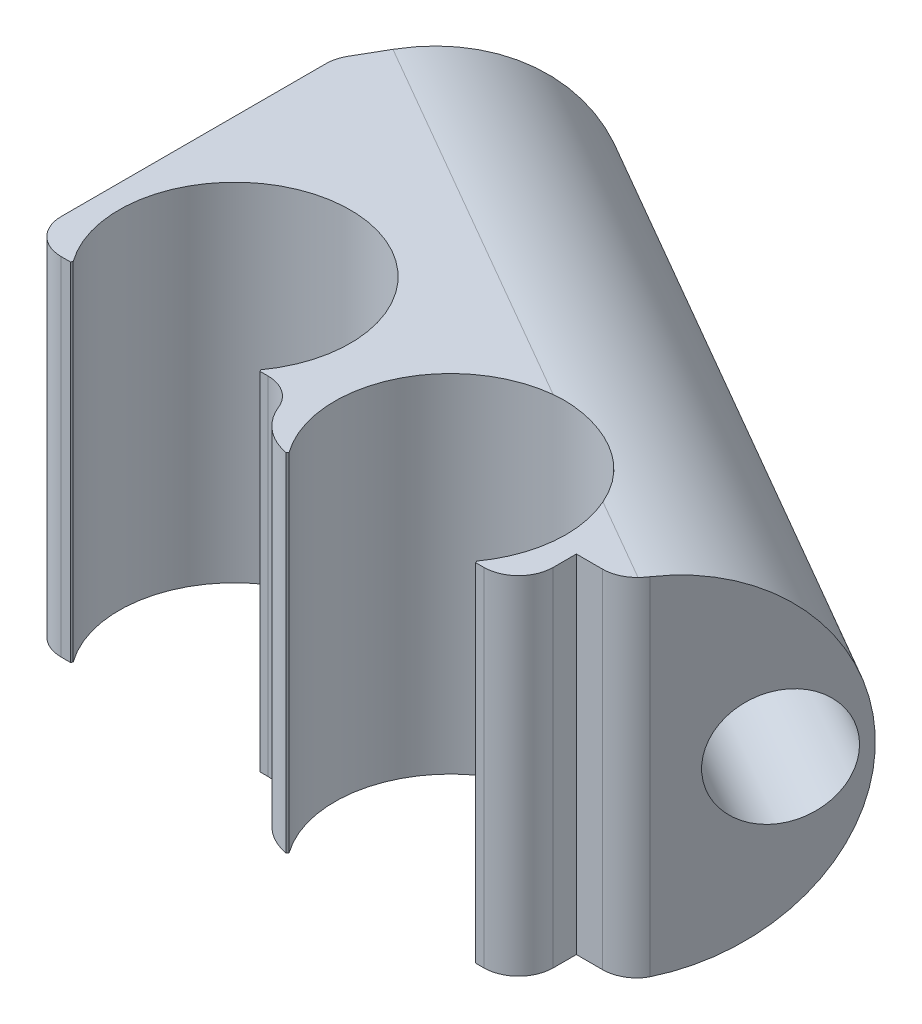
ISO-10303-21;
HEADER;
FILE_DESCRIPTION(('STEP AP214'),'2;1');
FILE_NAME('part.step','',(''),(''),'','','');
FILE_SCHEMA(('AUTOMOTIVE_DESIGN { 1 0 10303 214 1 1 1 1 }'));
ENDSEC;
DATA;
#1=APPLICATION_CONTEXT('core data for automotive mechanical design processes');
#2=APPLICATION_PROTOCOL_DEFINITION('international standard','automotive_design',2000,#1);
#3=PRODUCT_CONTEXT('',#1,'mechanical');
#4=PRODUCT('Part','Part','',(#3));
#5=PRODUCT_RELATED_PRODUCT_CATEGORY('part','',(#4));
#6=PRODUCT_DEFINITION_FORMATION('','',#4);
#7=PRODUCT_DEFINITION_CONTEXT('part definition',#1,'design');
#8=PRODUCT_DEFINITION('design','',#6,#7);
#9=PRODUCT_DEFINITION_SHAPE('','',#8);
#10=(LENGTH_UNIT() NAMED_UNIT(*) SI_UNIT(.MILLI.,.METRE.));
#11=(NAMED_UNIT(*) PLANE_ANGLE_UNIT() SI_UNIT($,.RADIAN.));
#12=(NAMED_UNIT(*) SI_UNIT($,.STERADIAN.) SOLID_ANGLE_UNIT());
#13=UNCERTAINTY_MEASURE_WITH_UNIT(LENGTH_MEASURE(1.E-05),#10,'distance_accuracy_value','');
#14=(GEOMETRIC_REPRESENTATION_CONTEXT(3) GLOBAL_UNCERTAINTY_ASSIGNED_CONTEXT((#13)) GLOBAL_UNIT_ASSIGNED_CONTEXT((#10,
#11,#12)) REPRESENTATION_CONTEXT('',''));
#15=CARTESIAN_POINT('',(0.,0.,0.));
#16=DIRECTION('',(0.,0.,1.));
#17=DIRECTION('',(1.,0.,0.));
#18=AXIS2_PLACEMENT_3D('',#15,#16,#17);
#19=CARTESIAN_POINT('',(-10.8884419053793,0.,-9.46410161513775));
#20=DIRECTION('',(0.,-1.,0.));
#21=DIRECTION('',(1.,0.,0.));
#22=AXIS2_PLACEMENT_3D('',#19,#20,#21);
#23=PLANE('',#22);
#24=DIRECTION('',(1.,0.,0.));
#25=VECTOR('',#24,1.);
#26=CARTESIAN_POINT('',(-2.97428644048852,0.,2.49999999999996));
#27=LINE('',#26,#25);
#28=CARTESIAN_POINT('',(-3.85098287368222,0.,2.49999999999996));
#29=VERTEX_POINT('',#28);
#30=CARTESIAN_POINT('',(-3.5,0.,2.49999999999996));
#31=VERTEX_POINT('',#30);
#32=EDGE_CURVE('E277',#29,#31,#27,.T.);
#33=ORIENTED_EDGE('',*,*,#32,.T.);
#34=CARTESIAN_POINT('',(-3.5,0.,0.999999999999965));
#35=DIRECTION('',(0.,-1.,0.));
#36=DIRECTION('',(0.,0.,-1.));
#37=AXIS2_PLACEMENT_3D('',#34,#35,#36);
#38=CIRCLE('',#37,1.5);
#39=CARTESIAN_POINT('',(-2.,0.,0.999999999999965));
#40=VERTEX_POINT('',#39);
#41=EDGE_CURVE('E586',#31,#40,#38,.F.);
#42=ORIENTED_EDGE('',*,*,#41,.T.);
#43=DIRECTION('',(0.,0.,1.));
#44=VECTOR('',#43,1.);
#45=CARTESIAN_POINT('',(-2.,0.,0.));
#46=LINE('',#45,#44);
#47=CARTESIAN_POINT('',(-2.,0.,0.));
#48=VERTEX_POINT('',#47);
#49=EDGE_CURVE('E679',#48,#40,#46,.T.);
#50=ORIENTED_EDGE('',*,*,#49,.F.);
#51=DIRECTION('',(1.,0.,0.));
#52=VECTOR('',#51,1.);
#53=CARTESIAN_POINT('',(-2.,0.,0.));
#54=LINE('',#53,#52);
#55=CARTESIAN_POINT('',(-0.866025403784438,0.,0.));
#56=VERTEX_POINT('',#55);
#57=EDGE_CURVE('E486',#48,#56,#54,.T.);
#58=ORIENTED_EDGE('',*,*,#57,.T.);
#59=CARTESIAN_POINT('',(-0.866025403784438,0.,-1.5));
#60=DIRECTION('',(0.,-1.,0.));
#61=DIRECTION('',(0.,0.,-1.));
#62=AXIS2_PLACEMENT_3D('',#59,#60,#61);
#63=CIRCLE('',#62,1.5);
#64=CARTESIAN_POINT('',(0.210731338641756,0.,-0.45568447409812));
#65=VERTEX_POINT('',#64);
#66=EDGE_CURVE('E284',#56,#65,#63,.F.);
#67=ORIENTED_EDGE('',*,*,#66,.T.);
#68=DIRECTION('',(-0.866025403784439,0.,-0.5));
#69=VECTOR('',#68,1.);
#70=CARTESIAN_POINT('',(-24.8647367097487,0.,-14.9330127018922));
#71=LINE('',#70,#69);
#72=CARTESIAN_POINT('',(-3.37821447251058,0.,-2.5277633042739));
#73=VERTEX_POINT('',#72);
#74=EDGE_CURVE('E620',#65,#73,#71,.T.);
#75=ORIENTED_EDGE('',*,*,#74,.T.);
#76=CARTESIAN_POINT('',(-7.94857288097705,0.,-0.500000000000024));
#77=DIRECTION('',(0.,-1.,0.));
#78=DIRECTION('',(0.,0.,-1.));
#79=AXIS2_PLACEMENT_3D('',#76,#77,#78);
#80=CIRCLE('',#79,4.99999999999999);
#81=CARTESIAN_POINT('',(-3.89106995363611,0.,2.42175803149738));
#82=VERTEX_POINT('',#81);
#83=EDGE_CURVE('E657',#73,#82,#80,.T.);
#84=ORIENTED_EDGE('',*,*,#83,.T.);
#85=DIRECTION('',(0.45598332434336,0.,0.889988318979962));
#86=VECTOR('',#85,1.);
#87=CARTESIAN_POINT('',(-3.89106995363611,0.,2.42175803149738));
#88=LINE('',#87,#86);
#89=EDGE_CURVE('E563',#82,#29,#88,.T.);
#90=ORIENTED_EDGE('',*,*,#89,.T.);
#91=EDGE_LOOP('',(#33,#42,#50,#58,#67,#75,#84,#90));
#92=FACE_BOUND('',#91,.T.);
#93=ADVANCED_FACE('F51',(#92),#23,.F.);
#94=CARTESIAN_POINT('',(-10.8884419053793,-15.,-9.46410161513775));
#95=DIRECTION('',(0.,-1.,0.));
#96=DIRECTION('',(1.,0.,0.));
#97=AXIS2_PLACEMENT_3D('',#94,#95,#96);
#98=PLANE('',#97);
#99=DIRECTION('',(0.,0.,-1.));
#100=VECTOR('',#99,1.);
#101=CARTESIAN_POINT('',(-2.,-15.,2.49999999999997));
#102=LINE('',#101,#100);
#103=CARTESIAN_POINT('',(-2.,-15.,0.999999999999965));
#104=VERTEX_POINT('',#103);
#105=CARTESIAN_POINT('',(-2.,-15.,0.));
#106=VERTEX_POINT('',#105);
#107=EDGE_CURVE('E683',#104,#106,#102,.T.);
#108=ORIENTED_EDGE('',*,*,#107,.F.);
#109=CARTESIAN_POINT('',(-3.5,-15.,0.999999999999965));
#110=DIRECTION('',(0.,-1.,0.));
#111=DIRECTION('',(0.,0.,-1.));
#112=AXIS2_PLACEMENT_3D('',#109,#110,#111);
#113=CIRCLE('',#112,1.5);
#114=CARTESIAN_POINT('',(-3.5,-15.,2.49999999999996));
#115=VERTEX_POINT('',#114);
#116=EDGE_CURVE('E582',#104,#115,#113,.T.);
#117=ORIENTED_EDGE('',*,*,#116,.T.);
#118=DIRECTION('',(1.,0.,0.));
#119=VECTOR('',#118,1.);
#120=CARTESIAN_POINT('',(-2.97428644048852,-15.,2.49999999999996));
#121=LINE('',#120,#119);
#122=CARTESIAN_POINT('',(-3.85098287368222,-15.,2.49999999999996));
#123=VERTEX_POINT('',#122);
#124=EDGE_CURVE('E248',#123,#115,#121,.T.);
#125=ORIENTED_EDGE('',*,*,#124,.F.);
#126=DIRECTION('',(-0.45598332434336,0.,-0.889988318979962));
#127=VECTOR('',#126,1.);
#128=CARTESIAN_POINT('',(-10.1694866410355,-15.,-9.83245657497071));
#129=LINE('',#128,#127);
#130=CARTESIAN_POINT('',(-3.89106995363611,-15.,2.42175803149738));
#131=VERTEX_POINT('',#130);
#132=EDGE_CURVE('E231',#123,#131,#129,.T.);
#133=ORIENTED_EDGE('',*,*,#132,.T.);
#134=CARTESIAN_POINT('',(-7.94857288097705,-15.,-0.500000000000024));
#135=DIRECTION('',(0.,-1.,0.));
#136=DIRECTION('',(0.,0.,-1.));
#137=AXIS2_PLACEMENT_3D('',#134,#135,#136);
#138=CIRCLE('',#137,4.99999999999999);
#139=CARTESIAN_POINT('',(-3.37821447251057,-15.,-2.52776330427389));
#140=VERTEX_POINT('',#139);
#141=EDGE_CURVE('E211',#140,#131,#138,.T.);
#142=ORIENTED_EDGE('',*,*,#141,.F.);
#143=DIRECTION('',(-0.866025403784439,0.,-0.5));
#144=VECTOR('',#143,1.);
#145=CARTESIAN_POINT('',(-12.0144076403878,-15.,-7.51387175452141));
#146=LINE('',#145,#144);
#147=CARTESIAN_POINT('',(0.210731338641756,-15.,-0.455684474098116));
#148=VERTEX_POINT('',#147);
#149=EDGE_CURVE('E227',#140,#148,#146,.F.);
#150=ORIENTED_EDGE('',*,*,#149,.T.);
#151=CARTESIAN_POINT('',(-0.866025403784438,-15.,-1.5));
#152=DIRECTION('',(0.,-1.,0.));
#153=DIRECTION('',(0.,0.,-1.));
#154=AXIS2_PLACEMENT_3D('',#151,#152,#153);
#155=CIRCLE('',#154,1.5);
#156=CARTESIAN_POINT('',(-0.866025403784438,-15.,0.));
#157=VERTEX_POINT('',#156);
#158=EDGE_CURVE('E241',#148,#157,#155,.T.);
#159=ORIENTED_EDGE('',*,*,#158,.T.);
#160=DIRECTION('',(1.,0.,0.));
#161=VECTOR('',#160,1.);
#162=CARTESIAN_POINT('',(-2.,-15.,0.));
#163=LINE('',#162,#161);
#164=EDGE_CURVE('E485',#106,#157,#163,.T.);
#165=ORIENTED_EDGE('',*,*,#164,.F.);
#166=EDGE_LOOP('',(#108,#117,#125,#133,#142,#150,#159,#165));
#167=FACE_BOUND('',#166,.T.);
#168=ADVANCED_FACE('F225',(#167),#98,.T.);
#169=CARTESIAN_POINT('',(-14.8025973702701,-15.,0.));
#170=DIRECTION('',(0.,0.,1.));
#171=DIRECTION('',(1.,0.,0.));
#172=AXIS2_PLACEMENT_3D('',#169,#170,#171);
#173=PLANE('',#172);
#174=DIRECTION('',(1.,0.,0.));
#175=VECTOR('',#174,1.);
#176=CARTESIAN_POINT('',(-24.7768838107586,-15.,0.));
#177=LINE('',#176,#175);
#178=CARTESIAN_POINT('',(-15.6792938034638,-15.,0.));
#179=VERTEX_POINT('',#178);
#180=CARTESIAN_POINT('',(-15.3283109297816,-15.,0.));
#181=VERTEX_POINT('',#180);
#182=EDGE_CURVE('E283',#179,#181,#177,.T.);
#183=ORIENTED_EDGE('',*,*,#182,.T.);
#184=DIRECTION('',(0.,-1.,0.));
#185=VECTOR('',#184,1.);
#186=CARTESIAN_POINT('',(-15.3283109297816,0.,0.));
#187=LINE('',#186,#185);
#188=CARTESIAN_POINT('',(-15.3283109297816,0.,0.));
#189=VERTEX_POINT('',#188);
#190=EDGE_CURVE('E588',#181,#189,#187,.F.);
#191=ORIENTED_EDGE('',*,*,#190,.T.);
#192=DIRECTION('',(1.,0.,0.));
#193=VECTOR('',#192,1.);
#194=CARTESIAN_POINT('',(-24.7768838107586,0.,0.));
#195=LINE('',#194,#193);
#196=CARTESIAN_POINT('',(-15.6792938034638,0.,0.));
#197=VERTEX_POINT('',#196);
#198=EDGE_CURVE('E612',#197,#189,#195,.T.);
#199=ORIENTED_EDGE('',*,*,#198,.F.);
#200=DIRECTION('',(0.,-1.,0.));
#201=VECTOR('',#200,1.);
#202=CARTESIAN_POINT('',(-15.6792938034638,-15.,0.));
#203=LINE('',#202,#201);
#204=EDGE_CURVE('E568',#197,#179,#203,.T.);
#205=ORIENTED_EDGE('',*,*,#204,.T.);
#206=EDGE_LOOP('',(#183,#191,#199,#205));
#207=FACE_BOUND('',#206,.T.);
#208=ADVANCED_FACE('F630',(#207),#173,.T.);
#209=CARTESIAN_POINT('',(-2.97428644048852,-15.,2.49999999999996));
#210=DIRECTION('',(0.,0.,1.));
#211=DIRECTION('',(1.,0.,0.));
#212=AXIS2_PLACEMENT_3D('',#209,#210,#211);
#213=PLANE('',#212);
#214=ORIENTED_EDGE('',*,*,#124,.T.);
#215=DIRECTION('',(0.,-1.,0.));
#216=VECTOR('',#215,1.);
#217=CARTESIAN_POINT('',(-3.5,-15.,2.49999999999996));
#218=LINE('',#217,#216);
#219=EDGE_CURVE('E584',#115,#31,#218,.F.);
#220=ORIENTED_EDGE('',*,*,#219,.T.);
#221=ORIENTED_EDGE('',*,*,#32,.F.);
#222=DIRECTION('',(0.,-1.,0.));
#223=VECTOR('',#222,1.);
#224=CARTESIAN_POINT('',(-3.85098287368222,-15.,2.49999999999996));
#225=LINE('',#224,#223);
#226=EDGE_CURVE('E565',#29,#123,#225,.T.);
#227=ORIENTED_EDGE('',*,*,#226,.T.);
#228=EDGE_LOOP('',(#214,#220,#221,#227));
#229=FACE_BOUND('',#228,.T.);
#230=ADVANCED_FACE('F756',(#229),#213,.T.);
#231=DIRECTION('',(0.,0.,1.));
#232=VECTOR('',#231,1.);
#233=CARTESIAN_POINT('',(-25.7768838107586,-15.,0.));
#234=LINE('',#233,#232);
#235=CARTESIAN_POINT('',(-25.7768838107586,-15.,-12.9512037903198));
#236=VERTEX_POINT('',#235);
#237=CARTESIAN_POINT('',(-25.7768838107586,-15.,-1.49999999999997));
#238=VERTEX_POINT('',#237);
#239=EDGE_CURVE('E672',#236,#238,#234,.T.);
#240=ORIENTED_EDGE('',*,*,#239,.F.);
#241=CARTESIAN_POINT('',(-24.2768838107586,-15.,-12.9512037903198));
#242=DIRECTION('',(0.,-1.,0.));
#243=DIRECTION('',(0.,0.,-1.));
#244=AXIS2_PLACEMENT_3D('',#241,#242,#243);
#245=CIRCLE('',#244,1.5);
#246=CARTESIAN_POINT('',(-25.5759219164353,-15.,-13.7012037903198));
#247=VERTEX_POINT('',#246);
#248=EDGE_CURVE('E601',#236,#247,#245,.T.);
#249=ORIENTED_EDGE('',*,*,#248,.T.);
#250=DIRECTION('',(0.499999999999997,0.,-0.86602540378444));
#251=VECTOR('',#250,1.);
#252=CARTESIAN_POINT('',(-23.7387709747403,-15.,-16.8832425625085));
#253=LINE('',#252,#251);
#254=CARTESIAN_POINT('',(-24.8647367097487,-15.,-14.9330127018922));
#255=VERTEX_POINT('',#254);
#256=EDGE_CURVE('E675',#247,#255,#253,.T.);
#257=ORIENTED_EDGE('',*,*,#256,.T.);
#258=CARTESIAN_POINT('',(-8.47765755084725,-15.,-5.47192813826874));
#259=VERTEX_POINT('',#258);
#260=EDGE_CURVE('E240',#255,#259,#146,.F.);
#261=ORIENTED_EDGE('',*,*,#260,.T.);
#262=CARTESIAN_POINT('',(-12.022071124639,-15.,2.39941581338083));
#263=VERTEX_POINT('',#262);
#264=EDGE_CURVE('E215',#263,#259,#138,.T.);
#265=ORIENTED_EDGE('',*,*,#264,.F.);
#266=DIRECTION('',(-0.517429042043676,0.,0.855726116493918));
#267=VECTOR('',#266,1.);
#268=CARTESIAN_POINT('',(-6.46566226562953,-15.,-6.78979427771262));
#269=LINE('',#268,#267);
#270=CARTESIAN_POINT('',(-12.0709341031518,-15.,2.48022559297485));
#271=VERTEX_POINT('',#270);
#272=EDGE_CURVE('E572',#263,#271,#269,.T.);
#273=ORIENTED_EDGE('',*,*,#272,.T.);
#274=CARTESIAN_POINT('',(-11.6110336984726,-15.,0.0228913426588841));
#275=DIRECTION('',(0.,-1.,0.));
#276=DIRECTION('',(0.,0.,-1.));
#277=AXIS2_PLACEMENT_3D('',#274,#275,#276);
#278=CIRCLE('',#277,2.5);
#279=CARTESIAN_POINT('',(-13.9343319680407,-15.,0.946084253497081));
#280=VERTEX_POINT('',#279);
#281=EDGE_CURVE('E315',#271,#280,#278,.T.);
#282=ORIENTED_EDGE('',*,*,#281,.T.);
#283=CARTESIAN_POINT('',(-15.3283109297816,-15.,1.5));
#284=DIRECTION('',(0.,-1.,0.));
#285=DIRECTION('',(0.,0.,-1.));
#286=AXIS2_PLACEMENT_3D('',#283,#284,#285);
#287=CIRCLE('',#286,1.5);
#288=EDGE_CURVE('E13',#280,#181,#287,.F.);
#289=ORIENTED_EDGE('',*,*,#288,.T.);
#290=ORIENTED_EDGE('',*,*,#182,.F.);
#291=DIRECTION('',(0.4559833243433,0.,0.889988318979993));
#292=VECTOR('',#291,1.);
#293=CARTESIAN_POINT('',(-18.5238962125493,-15.,-5.55209539707298));
#294=LINE('',#293,#292);
#295=CARTESIAN_POINT('',(-15.7193808834177,-15.,-0.0782419685026068));
#296=VERTEX_POINT('',#295);
#297=EDGE_CURVE('E549',#179,#296,#294,.F.);
#298=ORIENTED_EDGE('',*,*,#297,.T.);
#299=CARTESIAN_POINT('',(-19.7768838107586,-15.,-3.));
#300=DIRECTION('',(0.,-1.,0.));
#301=DIRECTION('',(0.,0.,-1.));
#302=AXIS2_PLACEMENT_3D('',#299,#300,#301);
#303=CIRCLE('',#302,4.99999999999999);
#304=CARTESIAN_POINT('',(-23.8343867380995,-15.,-0.0782419685025838));
#305=VERTEX_POINT('',#304);
#306=EDGE_CURVE('E649',#305,#296,#303,.T.);
#307=ORIENTED_EDGE('',*,*,#306,.F.);
#308=DIRECTION('',(-0.455983324343331,0.,0.889988318979977));
#309=VECTOR('',#308,1.);
#310=CARTESIAN_POINT('',(-17.3336876463351,-15.,-12.7663074042419));
#311=LINE('',#310,#309);
#312=CARTESIAN_POINT('',(-23.8744738180534,-15.,0.));
#313=VERTEX_POINT('',#312);
#314=EDGE_CURVE('E551',#305,#313,#311,.T.);
#315=ORIENTED_EDGE('',*,*,#314,.T.);
#316=CARTESIAN_POINT('',(-24.2768838107586,-15.,0.));
#317=VERTEX_POINT('',#316);
#318=EDGE_CURVE('E286',#317,#313,#177,.T.);
#319=ORIENTED_EDGE('',*,*,#318,.F.);
#320=CARTESIAN_POINT('',(-24.2768838107586,-15.,-1.49999999999997));
#321=DIRECTION('',(0.,-1.,0.));
#322=DIRECTION('',(0.,0.,-1.));
#323=AXIS2_PLACEMENT_3D('',#320,#321,#322);
#324=CIRCLE('',#323,1.5);
#325=EDGE_CURVE('E599',#317,#238,#324,.T.);
#326=ORIENTED_EDGE('',*,*,#325,.T.);
#327=EDGE_LOOP('',(#240,#249,#257,#261,#265,#273,#282,#289,#290,#298,#307,#315,#319,#326));
#328=FACE_BOUND('',#327,.T.);
#329=ADVANCED_FACE('F627',(#328),#98,.T.);
#330=CARTESIAN_POINT('',(-25.7768838107586,-15.,-13.3531275789665));
#331=DIRECTION('',(-0.86602540378444,0.,-0.499999999999997));
#332=DIRECTION('',(-0.499999999999997,0.,0.86602540378444));
#333=AXIS2_PLACEMENT_3D('',#330,#331,#332);
#334=PLANE('',#333);
#335=CARTESIAN_POINT('',(-22.6147367097487,-7.5,-18.8301270189222));
#336=DIRECTION('',(-0.86602540378444,0.,-0.499999999999997));
#337=DIRECTION('',(-0.499999999999997,0.,0.86602540378444));
#338=AXIS2_PLACEMENT_3D('',#335,#336,#337);
#339=CIRCLE('',#338,2.49999999999997);
#340=CARTESIAN_POINT('',(-23.8647367097487,-7.5,-16.6650635094611));
#341=VERTEX_POINT('',#340);
#342=EDGE_CURVE('E666',#341,#341,#339,.T.);
#343=ORIENTED_EDGE('',*,*,#342,.F.);
#344=EDGE_LOOP('',(#343));
#345=FACE_BOUND('',#344,.T.);
#346=ORIENTED_EDGE('',*,*,#256,.F.);
#347=DIRECTION('',(0.,-1.,0.));
#348=VECTOR('',#347,1.);
#349=CARTESIAN_POINT('',(-25.5759219164353,0.,-13.7012037903198));
#350=LINE('',#349,#348);
#351=CARTESIAN_POINT('',(-25.5759219164353,0.,-13.7012037903198));
#352=VERTEX_POINT('',#351);
#353=EDGE_CURVE('E74',#247,#352,#350,.F.);
#354=ORIENTED_EDGE('',*,*,#353,.T.);
#355=DIRECTION('',(0.499999999999997,0.,-0.86602540378444));
#356=VECTOR('',#355,1.);
#357=CARTESIAN_POINT('',(-23.7387709747403,0.,-16.8832425625085));
#358=LINE('',#357,#356);
#359=CARTESIAN_POINT('',(-24.8647367097487,0.,-14.9330127018922));
#360=VERTEX_POINT('',#359);
#361=EDGE_CURVE('E680',#352,#360,#358,.T.);
#362=ORIENTED_EDGE('',*,*,#361,.T.);
#363=CARTESIAN_POINT('',(-24.8647367097487,-7.5,-14.9330127018922));
#364=DIRECTION('',(-0.86602540378444,0.,-0.499999999999997));
#365=DIRECTION('',(-0.499999999999997,0.,0.86602540378444));
#366=AXIS2_PLACEMENT_3D('',#363,#364,#365);
#367=CIRCLE('',#366,7.5);
#368=EDGE_CURVE('E320',#360,#255,#367,.T.);
#369=ORIENTED_EDGE('',*,*,#368,.T.);
#370=EDGE_LOOP('',(#346,#354,#362,#369));
#371=FACE_BOUND('',#370,.T.);
#372=ADVANCED_FACE('F912',(#345,#371),#334,.T.);
#373=CARTESIAN_POINT('',(2.,-15.,-3.46410161513776));
#374=DIRECTION('',(0.866025403784439,0.,0.5));
#375=DIRECTION('',(0.5,0.,-0.866025403784439));
#376=AXIS2_PLACEMENT_3D('',#373,#374,#375);
#377=PLANE('',#376);
#378=CARTESIAN_POINT('',(2.5,-7.5,-4.3301270189222));
#379=DIRECTION('',(0.866025403784439,0.,0.5));
#380=DIRECTION('',(0.5,0.,-0.866025403784439));
#381=AXIS2_PLACEMENT_3D('',#378,#379,#380);
#382=CIRCLE('',#381,2.49999999999998);
#383=CARTESIAN_POINT('',(3.74999999999999,-7.5,-6.49519052838327));
#384=VERTEX_POINT('',#383);
#385=EDGE_CURVE('E659',#384,#384,#382,.T.);
#386=ORIENTED_EDGE('',*,*,#385,.F.);
#387=EDGE_LOOP('',(#386));
#388=FACE_BOUND('',#387,.T.);
#389=CARTESIAN_POINT('',(0.25,-7.5,-0.433012701892218));
#390=DIRECTION('',(0.866025403784439,0.,0.5));
#391=DIRECTION('',(0.5,0.,-0.866025403784439));
#392=AXIS2_PLACEMENT_3D('',#389,#390,#391);
#393=CIRCLE('',#392,7.5);
#394=CARTESIAN_POINT('',(0.433012701892222,-14.9910630356301,-0.75));
#395=VERTEX_POINT('',#394);
#396=CARTESIAN_POINT('',(0.433012701892222,-0.00893696436984719,-0.75));
#397=VERTEX_POINT('',#396);
#398=EDGE_CURVE('E705',#395,#397,#393,.T.);
#399=ORIENTED_EDGE('',*,*,#398,.T.);
#400=DIRECTION('',(0.,1.,0.));
#401=VECTOR('',#400,1.);
#402=CARTESIAN_POINT('',(0.43301270189222,-15.,-0.75));
#403=LINE('',#402,#401);
#404=EDGE_CURVE('E722',#397,#395,#403,.F.);
#405=ORIENTED_EDGE('',*,*,#404,.T.);
#406=EDGE_LOOP('',(#399,#405));
#407=FACE_BOUND('',#406,.T.);
#408=ADVANCED_FACE('F907',(#388,#407),#377,.T.);
#409=CARTESIAN_POINT('',(-24.2768838107586,0.,0.));
#410=VERTEX_POINT('',#409);
#411=CARTESIAN_POINT('',(-23.8744738180534,0.,0.));
#412=VERTEX_POINT('',#411);
#413=EDGE_CURVE('E655',#410,#412,#195,.T.);
#414=ORIENTED_EDGE('',*,*,#413,.F.);
#415=DIRECTION('',(0.,1.,0.));
#416=VECTOR('',#415,1.);
#417=CARTESIAN_POINT('',(-24.2768838107586,-15.,0.));
#418=LINE('',#417,#416);
#419=EDGE_CURVE('E607',#410,#317,#418,.F.);
#420=ORIENTED_EDGE('',*,*,#419,.T.);
#421=ORIENTED_EDGE('',*,*,#318,.T.);
#422=DIRECTION('',(0.,1.,0.));
#423=VECTOR('',#422,1.);
#424=CARTESIAN_POINT('',(-23.8744738180534,0.,0.));
#425=LINE('',#424,#423);
#426=EDGE_CURVE('E554',#313,#412,#425,.T.);
#427=ORIENTED_EDGE('',*,*,#426,.T.);
#428=EDGE_LOOP('',(#414,#420,#421,#427));
#429=FACE_BOUND('',#428,.T.);
#430=ADVANCED_FACE('F642',(#429),#173,.T.);
#431=ORIENTED_EDGE('',*,*,#361,.F.);
#432=CARTESIAN_POINT('',(-24.2768838107586,0.,-12.9512037903198));
#433=DIRECTION('',(0.,-1.,0.));
#434=DIRECTION('',(0.,0.,-1.));
#435=AXIS2_PLACEMENT_3D('',#432,#433,#434);
#436=CIRCLE('',#435,1.5);
#437=CARTESIAN_POINT('',(-25.7768838107586,0.,-12.9512037903198));
#438=VERTEX_POINT('',#437);
#439=EDGE_CURVE('E605',#352,#438,#436,.F.);
#440=ORIENTED_EDGE('',*,*,#439,.T.);
#441=DIRECTION('',(0.,0.,-1.));
#442=VECTOR('',#441,1.);
#443=CARTESIAN_POINT('',(-25.7768838107586,0.,-13.3531275789665));
#444=LINE('',#443,#442);
#445=CARTESIAN_POINT('',(-25.7768838107586,0.,-1.49999999999997));
#446=VERTEX_POINT('',#445);
#447=EDGE_CURVE('E669',#446,#438,#444,.T.);
#448=ORIENTED_EDGE('',*,*,#447,.F.);
#449=CARTESIAN_POINT('',(-24.2768838107586,0.,-1.49999999999997));
#450=DIRECTION('',(0.,-1.,0.));
#451=DIRECTION('',(0.,0.,-1.));
#452=AXIS2_PLACEMENT_3D('',#449,#450,#451);
#453=CIRCLE('',#452,1.5);
#454=EDGE_CURVE('E66',#446,#410,#453,.F.);
#455=ORIENTED_EDGE('',*,*,#454,.T.);
#456=ORIENTED_EDGE('',*,*,#413,.T.);
#457=DIRECTION('',(0.455983324343331,0.,-0.889988318979977));
#458=VECTOR('',#457,1.);
#459=CARTESIAN_POINT('',(-23.8343867380995,0.,-0.0782419685025844));
#460=LINE('',#459,#458);
#461=CARTESIAN_POINT('',(-23.8343867380995,0.,-0.0782419685025826));
#462=VERTEX_POINT('',#461);
#463=EDGE_CURVE('E559',#412,#462,#460,.T.);
#464=ORIENTED_EDGE('',*,*,#463,.T.);
#465=CARTESIAN_POINT('',(-19.7768838107586,0.,-3.));
#466=DIRECTION('',(0.,1.,0.));
#467=DIRECTION('',(0.,0.,1.));
#468=AXIS2_PLACEMENT_3D('',#465,#466,#467);
#469=CIRCLE('',#468,4.99999999999999);
#470=CARTESIAN_POINT('',(-15.7193808834177,0.,-0.078241968502606));
#471=VERTEX_POINT('',#470);
#472=EDGE_CURVE('E654',#471,#462,#469,.T.);
#473=ORIENTED_EDGE('',*,*,#472,.F.);
#474=DIRECTION('',(-0.4559833243433,0.,-0.889988318979993));
#475=VECTOR('',#474,1.);
#476=CARTESIAN_POINT('',(-15.7193808834177,0.,-0.0782419685026037));
#477=LINE('',#476,#475);
#478=EDGE_CURVE('E557',#471,#197,#477,.F.);
#479=ORIENTED_EDGE('',*,*,#478,.T.);
#480=ORIENTED_EDGE('',*,*,#198,.T.);
#481=CARTESIAN_POINT('',(-15.3283109297816,0.,1.5));
#482=DIRECTION('',(0.,-1.,0.));
#483=DIRECTION('',(0.,0.,-1.));
#484=AXIS2_PLACEMENT_3D('',#481,#482,#483);
#485=CIRCLE('',#484,1.5);
#486=CARTESIAN_POINT('',(-13.9343319680407,0.,0.946084253497081));
#487=VERTEX_POINT('',#486);
#488=EDGE_CURVE('E59',#189,#487,#485,.T.);
#489=ORIENTED_EDGE('',*,*,#488,.T.);
#490=CARTESIAN_POINT('',(-11.6110336984726,0.,0.0228913426588841));
#491=DIRECTION('',(0.,-1.,0.));
#492=DIRECTION('',(0.,0.,-1.));
#493=AXIS2_PLACEMENT_3D('',#490,#491,#492);
#494=CIRCLE('',#493,2.5);
#495=CARTESIAN_POINT('',(-12.0709341031518,0.,2.48022559297485));
#496=VERTEX_POINT('',#495);
#497=EDGE_CURVE('E250',#487,#496,#494,.F.);
#498=ORIENTED_EDGE('',*,*,#497,.T.);
#499=DIRECTION('',(0.517429042043676,0.,-0.855726116493918));
#500=VECTOR('',#499,1.);
#501=CARTESIAN_POINT('',(-12.022071124639,0.,2.39941581338083));
#502=LINE('',#501,#500);
#503=CARTESIAN_POINT('',(-12.022071124639,0.,2.39941581338083));
#504=VERTEX_POINT('',#503);
#505=EDGE_CURVE('E577',#496,#504,#502,.T.);
#506=ORIENTED_EDGE('',*,*,#505,.T.);
#507=CARTESIAN_POINT('',(-8.47765755084724,0.,-5.47192813826874));
#508=VERTEX_POINT('',#507);
#509=EDGE_CURVE('E232',#504,#508,#80,.T.);
#510=ORIENTED_EDGE('',*,*,#509,.T.);
#511=EDGE_CURVE('E745',#508,#360,#71,.T.);
#512=ORIENTED_EDGE('',*,*,#511,.T.);
#513=EDGE_LOOP('',(#431,#440,#448,#455,#456,#464,#473,#479,#480,#489,#498,#506,#510,#512));
#514=FACE_BOUND('',#513,.T.);
#515=ADVANCED_FACE('F610',(#514),#23,.F.);
#516=CARTESIAN_POINT('',(-12.3073683548744,-7.5,-7.68301270189221));
#517=DIRECTION('',(-0.866025403784439,0.,-0.5));
#518=DIRECTION('',(-0.5,0.,0.866025403784439));
#519=AXIS2_PLACEMENT_3D('',#516,#517,#518);
#520=CYLINDRICAL_SURFACE('',#519,7.5);
#521=CARTESIAN_POINT('',(-8.47765755084724,-15.,-5.47192813826874));
#522=CARTESIAN_POINT('',(-8.33806198218021,-14.999988221003,-5.48679830433122));
#523=CARTESIAN_POINT('',(-8.19785370533572,-14.9986321965594,-5.49575819306232));
#524=CARTESIAN_POINT('',(-7.91722785990933,-14.9941063168906,-5.50186672479822));
#525=CARTESIAN_POINT('',(-7.77681032547061,-14.9909367308428,-5.49901712023197));
#526=CARTESIAN_POINT('',(-7.49677283159282,-14.9836587170865,-5.48152242797513));
#527=CARTESIAN_POINT('',(-7.35715269324796,-14.9795505091916,-5.46688009997005));
#528=CARTESIAN_POINT('',(-7.07964018753889,-14.9711577844458,-5.42591371484221));
#529=CARTESIAN_POINT('',(-6.94174784500694,-14.9668732650646,-5.39958949002219));
#530=CARTESIAN_POINT('',(-6.66861554579384,-14.95877825014,-5.33543112570012));
#531=CARTESIAN_POINT('',(-6.5333762690034,-14.9549678748007,-5.2975940758293));
#532=CARTESIAN_POINT('',(-6.26653681468309,-14.9483338313266,-5.21067336554435));
#533=CARTESIAN_POINT('',(-6.13493660346565,-14.9455101540548,-5.16158980928051));
#534=CARTESIAN_POINT('',(-5.87636970824173,-14.9412031071996,-5.05254345278591));
#535=CARTESIAN_POINT('',(-5.74940096192316,-14.9397191339016,-4.99258556752676));
#536=CARTESIAN_POINT('',(-5.50094934541855,-14.9382675244466,-4.86220364526641));
#537=CARTESIAN_POINT('',(-5.379466380235,-14.9382998620215,-4.79177978959556));
#538=CARTESIAN_POINT('',(-5.14322628018213,-14.9398745261502,-4.64120628012153));
#539=CARTESIAN_POINT('',(-5.02844944047143,-14.9414121658089,-4.56108749087469));
#540=CARTESIAN_POINT('',(-4.80602635510333,-14.945806612344,-4.39152421088982));
#541=CARTESIAN_POINT('',(-4.69838044642897,-14.9486634815117,-4.3020792799441));
#542=CARTESIAN_POINT('',(-4.49098519556041,-14.9553419709738,-4.11450253808585));
#543=CARTESIAN_POINT('',(-4.39123514456747,-14.9591635045423,-4.01637150858976));
#544=CARTESIAN_POINT('',(-4.20030613916911,-14.9672581705699,-3.81210879219455));
#545=CARTESIAN_POINT('',(-4.10912924501447,-14.9715314110591,-3.70597519315053));
#546=CARTESIAN_POINT('',(-3.89339220430283,-14.9819465857265,-3.4323944891022));
#547=CARTESIAN_POINT('',(-3.77443708645939,-14.9879752217735,-3.26044085628028));
#548=CARTESIAN_POINT('',(-3.61293474441527,-14.9947433176483,-2.99261408508825));
#549=CARTESIAN_POINT('',(-3.56194517507706,-14.9966198087932,-2.90174050624042));
#550=CARTESIAN_POINT('',(-3.46572029649011,-14.9992471976092,-2.71695188158977));
#551=CARTESIAN_POINT('',(-3.4204864475848,-14.999997810141,-2.62303607146379));
#552=CARTESIAN_POINT('',(-3.37821447251058,-15.,-2.52776330427389));
#553=B_SPLINE_CURVE_WITH_KNOTS('',3,(#521,#522,#523,#524,#525,#526,#527,#528,#529,#530,#531,
#532,#533,#534,#535,#536,#537,#538,#539,#540,#541,#542,#543,#544,#545,#546,#547,#548,#549,#550,
#551,#552),.UNSPECIFIED.,.F.,.F.,(4,2,2,2,2,2,2,2,2,2,2,2,2,2,2,4),(0.,0.421002148620709,
0.841941826319341,1.26278302602754,1.68363026723786,2.10458398446053,2.52553380352348,
2.9462938339897,3.36704657533955,3.78649341783824,4.205960067819,4.62538902013337,
5.04491851091477,5.67055041148866,5.98303127618303,6.29559126621261),.UNSPECIFIED.);
#554=EDGE_CURVE('E206',#259,#140,#553,.T.);
#555=ORIENTED_EDGE('',*,*,#554,.F.);
#556=ORIENTED_EDGE('',*,*,#260,.F.);
#557=ORIENTED_EDGE('',*,*,#368,.F.);
#558=ORIENTED_EDGE('',*,*,#511,.F.);
#559=CARTESIAN_POINT('',(-3.37821447251058,0.,-2.5277633042739));
#560=CARTESIAN_POINT('',(-3.43513431527549,-1.17789969898225E-05,-2.65609169602652));
#561=CARTESIAN_POINT('',(-3.49747896244152,-0.00136780344059093,-2.78199556996025));
#562=CARTESIAN_POINT('',(-3.63250174149161,-0.00589368310938669,-3.02807894692593));
#563=CARTESIAN_POINT('',(-3.70517833865608,-0.00906326915721038,-3.14825929660351));
#564=CARTESIAN_POINT('',(-3.86034793352079,-0.0163412829135225,-3.38203153418539));
#565=CARTESIAN_POINT('',(-3.94283863071617,-0.0204494908084172,-3.4956249568694));
#566=CARTESIAN_POINT('',(-4.11707281379262,-0.0288422155542336,-3.71547464411741));
#567=CARTESIAN_POINT('',(-4.20881643248767,-0.0331267349353606,-3.8217308033274));
#568=CARTESIAN_POINT('',(-4.40094535546239,-0.0412217498599579,-4.02619113087897));
#569=CARTESIAN_POINT('',(-4.50133284025,-0.0450321251992709,-4.12439325523352));
#570=CARTESIAN_POINT('',(-4.71002811063191,-0.0516661686734262,-4.31202264626441));
#571=CARTESIAN_POINT('',(-4.8183358228732,-0.0544898459451513,-4.40144999419019));
#572=CARTESIAN_POINT('',(-5.04205618539962,-0.0587968928003836,-4.57085231578447));
#573=CARTESIAN_POINT('',(-5.15746561035052,-0.0602808660983677,-4.65083153295345));
#574=CARTESIAN_POINT('',(-5.39460547547453,-0.0617324755533646,-4.80080598332757));
#575=CARTESIAN_POINT('',(-5.51633580610971,-0.0617001379784869,-4.87080138946816));
#576=CARTESIAN_POINT('',(-5.76485634047764,-0.0601254738498355,-5.0001045627695));
#577=CARTESIAN_POINT('',(-5.8916296671412,-0.0585878341911141,-5.05944482710164));
#578=CARTESIAN_POINT('',(-6.14968731784116,-0.0541933876560456,-5.16728722942609));
#579=CARTESIAN_POINT('',(-6.28097185461708,-0.0513365184882706,-5.21578885547869));
#580=CARTESIAN_POINT('',(-6.54711570365972,-0.0446580290262276,-5.30161004042599));
#581=CARTESIAN_POINT('',(-6.68197469359932,-0.0408364954576742,-5.33893060386662));
#582=CARTESIAN_POINT('',(-6.95433589774277,-0.0327418294300899,-5.40214861466329));
#583=CARTESIAN_POINT('',(-7.09183873778729,-0.0284685889409306,-5.42804332171736));
#584=CARTESIAN_POINT('',(-7.43663509783419,-0.0180534142734578,-5.47808672748675));
#585=CARTESIAN_POINT('',(-7.64502887105271,-0.0120247782264746,-5.49512806503839));
#586=CARTESIAN_POINT('',(-7.95772482974062,-0.00525668235172406,-5.50107981042327));
#587=CARTESIAN_POINT('',(-8.06191844222476,-0.00338019120679527,-5.49980128337426));
#588=CARTESIAN_POINT('',(-8.27006252479608,-0.000752802390811534,-5.49074016038131));
#589=CARTESIAN_POINT('',(-8.37401292663483,-2.18985900216978E-06,-5.48295591758127));
#590=CARTESIAN_POINT('',(-8.47765755084724,0.,-5.47192813826874));
#591=B_SPLINE_CURVE_WITH_KNOTS('',3,(#559,#560,#561,#562,#563,#564,#565,#566,#567,#568,#569,
#570,#571,#572,#573,#574,#575,#576,#577,#578,#579,#580,#581,#582,#583,#584,#585,#586,#587,#588,
#589,#590),.UNSPECIFIED.,.F.,.F.,(4,2,2,2,2,2,2,2,2,2,2,2,2,2,2,4),(0.,0.421002148620709,
0.841941826319341,1.26278302602754,1.68363026723786,2.10458398446053,2.52553380352348,
2.9462938339897,3.36704657533955,3.78649341783824,4.205960067819,4.62538902013337,
5.04491851091477,5.67055041148865,5.98303127618302,6.2955912662126),.UNSPECIFIED.);
#592=EDGE_CURVE('E221',#73,#508,#591,.T.);
#593=ORIENTED_EDGE('',*,*,#592,.F.);
#594=ORIENTED_EDGE('',*,*,#74,.F.);
#595=CARTESIAN_POINT('',(0.210731338641756,0.,-0.45568447409812));
#596=CARTESIAN_POINT('',(0.253853852218841,2.24625559459824E-05,-0.500194369953774));
#597=CARTESIAN_POINT('',(0.29393855594694,-0.000711053197097083,-0.546975611710248));
#598=CARTESIAN_POINT('',(0.368032343695512,-0.00369004132077327,-0.645080787012058));
#599=CARTESIAN_POINT('',(0.402041427717568,-0.0059355136910125,-0.696404720556211));
#600=CARTESIAN_POINT('',(0.43301270189222,-0.00893696436984689,-0.75));
#601=B_SPLINE_CURVE_WITH_KNOTS('',3,(#595,#596,#597,#598,#599,#600),.UNSPECIFIED.,.F.,.F.,(4,2,
4),(0.,0.184830340819531,0.36966068159091),.UNSPECIFIED.);
#602=EDGE_CURVE('E484',#65,#397,#601,.T.);
#603=ORIENTED_EDGE('',*,*,#602,.T.);
#604=ORIENTED_EDGE('',*,*,#398,.F.);
#605=CARTESIAN_POINT('',(0.43301270189222,-14.9910630356301,-0.75));
#606=CARTESIAN_POINT('',(0.402041427717567,-14.994064486309,-0.696404720556211));
#607=CARTESIAN_POINT('',(0.368032343695511,-14.9963099586792,-0.645080787012058));
#608=CARTESIAN_POINT('',(0.293938555946939,-14.9992889468029,-0.546975611710246));
#609=CARTESIAN_POINT('',(0.253853852218841,-15.0000224625559,-0.500194369953771));
#610=CARTESIAN_POINT('',(0.210731338641756,-15.,-0.455684474098115));
#611=B_SPLINE_CURVE_WITH_KNOTS('',3,(#605,#606,#607,#608,#609,#610),.UNSPECIFIED.,.F.,.F.,(4,2,
4),(0.,0.184830340771381,0.369660681590914),.UNSPECIFIED.);
#612=EDGE_CURVE('E237',#395,#148,#611,.T.);
#613=ORIENTED_EDGE('',*,*,#612,.T.);
#614=ORIENTED_EDGE('',*,*,#149,.F.);
#615=EDGE_LOOP('',(#555,#556,#557,#558,#593,#594,#603,#604,#613,#614));
#616=FACE_BOUND('',#615,.T.);
#617=ADVANCED_FACE('F234',(#616),#520,.T.);
#618=CARTESIAN_POINT('',(-0.866025403784438,-15.,-1.5));
#619=DIRECTION('',(0.,1.,0.));
#620=DIRECTION('',(0.,0.,1.));
#621=AXIS2_PLACEMENT_3D('',#618,#619,#620);
#622=CYLINDRICAL_SURFACE('',#621,1.5);
#623=ORIENTED_EDGE('',*,*,#612,.F.);
#624=ORIENTED_EDGE('',*,*,#404,.F.);
#625=ORIENTED_EDGE('',*,*,#602,.F.);
#626=ORIENTED_EDGE('',*,*,#66,.F.);
#627=DIRECTION('',(0.,1.,0.));
#628=VECTOR('',#627,1.);
#629=CARTESIAN_POINT('',(-0.866025403784438,-15.,0.));
#630=LINE('',#629,#628);
#631=EDGE_CURVE('E259',#157,#56,#630,.T.);
#632=ORIENTED_EDGE('',*,*,#631,.F.);
#633=ORIENTED_EDGE('',*,*,#158,.F.);
#634=EDGE_LOOP('',(#623,#624,#625,#626,#632,#633));
#635=FACE_BOUND('',#634,.T.);
#636=ADVANCED_FACE('F500',(#635),#622,.T.);
#637=CARTESIAN_POINT('',(-11.6110336984726,-15.,0.0228913426588841));
#638=DIRECTION('',(0.,1.,0.));
#639=DIRECTION('',(0.,0.,1.));
#640=AXIS2_PLACEMENT_3D('',#637,#638,#639);
#641=CYLINDRICAL_SURFACE('',#640,2.5);
#642=ORIENTED_EDGE('',*,*,#497,.F.);
#643=DIRECTION('',(0.,1.,0.));
#644=VECTOR('',#643,1.);
#645=CARTESIAN_POINT('',(-13.9343319680407,-15.,0.946084253497081));
#646=LINE('',#645,#644);
#647=EDGE_CURVE('E591',#487,#280,#646,.F.);
#648=ORIENTED_EDGE('',*,*,#647,.T.);
#649=ORIENTED_EDGE('',*,*,#281,.F.);
#650=DIRECTION('',(0.,1.,0.));
#651=VECTOR('',#650,1.);
#652=CARTESIAN_POINT('',(-12.0709341031518,-15.,2.48022559297485));
#653=LINE('',#652,#651);
#654=EDGE_CURVE('E574',#271,#496,#653,.T.);
#655=ORIENTED_EDGE('',*,*,#654,.T.);
#656=EDGE_LOOP('',(#642,#648,#649,#655));
#657=FACE_BOUND('',#656,.T.);
#658=ADVANCED_FACE('F504',(#657),#641,.T.);
#659=CARTESIAN_POINT('',(-2.,-15.,0.));
#660=DIRECTION('',(0.,0.,-1.));
#661=DIRECTION('',(-1.,0.,0.));
#662=AXIS2_PLACEMENT_3D('',#659,#660,#661);
#663=PLANE('',#662);
#664=ORIENTED_EDGE('',*,*,#631,.T.);
#665=ORIENTED_EDGE('',*,*,#57,.F.);
#666=DIRECTION('',(0.,1.,0.));
#667=VECTOR('',#666,1.);
#668=CARTESIAN_POINT('',(-2.,-15.,0.));
#669=LINE('',#668,#667);
#670=EDGE_CURVE('E676',#106,#48,#669,.T.);
#671=ORIENTED_EDGE('',*,*,#670,.F.);
#672=ORIENTED_EDGE('',*,*,#164,.T.);
#673=EDGE_LOOP('',(#664,#665,#671,#672));
#674=FACE_BOUND('',#673,.T.);
#675=ADVANCED_FACE('F508',(#674),#663,.F.);
#676=CARTESIAN_POINT('',(-2.,0.,0.));
#677=DIRECTION('',(1.,0.,0.));
#678=DIRECTION('',(0.,0.,-1.));
#679=AXIS2_PLACEMENT_3D('',#676,#677,#678);
#680=PLANE('',#679);
#681=ORIENTED_EDGE('',*,*,#49,.T.);
#682=DIRECTION('',(0.,-1.,0.));
#683=VECTOR('',#682,1.);
#684=CARTESIAN_POINT('',(-2.,0.,0.999999999999965));
#685=LINE('',#684,#683);
#686=EDGE_CURVE('E579',#40,#104,#685,.T.);
#687=ORIENTED_EDGE('',*,*,#686,.T.);
#688=ORIENTED_EDGE('',*,*,#107,.T.);
#689=ORIENTED_EDGE('',*,*,#670,.T.);
#690=EDGE_LOOP('',(#681,#687,#688,#689));
#691=FACE_BOUND('',#690,.T.);
#692=ADVANCED_FACE('F512',(#691),#680,.T.);
#693=CARTESIAN_POINT('',(-25.7768838107586,0.,0.));
#694=DIRECTION('',(1.,0.,0.));
#695=DIRECTION('',(0.,0.,-1.));
#696=AXIS2_PLACEMENT_3D('',#693,#694,#695);
#697=PLANE('',#696);
#698=ORIENTED_EDGE('',*,*,#447,.T.);
#699=DIRECTION('',(0.,-1.,0.));
#700=VECTOR('',#699,1.);
#701=CARTESIAN_POINT('',(-25.7768838107586,-15.,-12.9512037903198));
#702=LINE('',#701,#700);
#703=EDGE_CURVE('E596',#438,#236,#702,.T.);
#704=ORIENTED_EDGE('',*,*,#703,.T.);
#705=ORIENTED_EDGE('',*,*,#239,.T.);
#706=DIRECTION('',(0.,1.,0.));
#707=VECTOR('',#706,1.);
#708=CARTESIAN_POINT('',(-25.7768838107586,0.,-1.49999999999997));
#709=LINE('',#708,#707);
#710=EDGE_CURVE('E593',#238,#446,#709,.T.);
#711=ORIENTED_EDGE('',*,*,#710,.T.);
#712=EDGE_LOOP('',(#698,#704,#705,#711));
#713=FACE_BOUND('',#712,.T.);
#714=ADVANCED_FACE('F516',(#713),#697,.F.);
#715=CARTESIAN_POINT('',(2.5,-7.5,-4.3301270189222));
#716=DIRECTION('',(0.866025403784439,0.,0.5));
#717=DIRECTION('',(0.5,0.,-0.866025403784439));
#718=AXIS2_PLACEMENT_3D('',#715,#716,#717);
#719=CYLINDRICAL_SURFACE('',#718,2.49999999999997);
#720=ORIENTED_EDGE('',*,*,#342,.T.);
#721=EDGE_LOOP('',(#720));
#722=FACE_BOUND('',#721,.T.);
#723=ORIENTED_EDGE('',*,*,#385,.T.);
#724=EDGE_LOOP('',(#723));
#725=FACE_BOUND('',#724,.T.);
#726=ADVANCED_FACE('F520',(#722,#725),#719,.F.);
#727=CARTESIAN_POINT('',(-19.7768838107586,0.,-3.));
#728=DIRECTION('',(0.,1.,0.));
#729=DIRECTION('',(0.,0.,1.));
#730=AXIS2_PLACEMENT_3D('',#727,#728,#729);
#731=CYLINDRICAL_SURFACE('',#730,4.99999999999999);
#732=ORIENTED_EDGE('',*,*,#472,.T.);
#733=DIRECTION('',(0.,1.,0.));
#734=VECTOR('',#733,1.);
#735=CARTESIAN_POINT('',(-23.8343867380995,0.,-0.0782419685025843));
#736=LINE('',#735,#734);
#737=EDGE_CURVE('E546',#462,#305,#736,.F.);
#738=ORIENTED_EDGE('',*,*,#737,.T.);
#739=ORIENTED_EDGE('',*,*,#306,.T.);
#740=DIRECTION('',(0.,1.,0.));
#741=VECTOR('',#740,1.);
#742=CARTESIAN_POINT('',(-15.7193808834177,0.,-0.0782419685026068));
#743=LINE('',#742,#741);
#744=EDGE_CURVE('E220',#296,#471,#743,.T.);
#745=ORIENTED_EDGE('',*,*,#744,.T.);
#746=EDGE_LOOP('',(#732,#738,#739,#745));
#747=FACE_BOUND('',#746,.T.);
#748=ADVANCED_FACE('F524',(#747),#731,.F.);
#749=CARTESIAN_POINT('',(-7.94857288097705,-15.,-0.500000000000024));
#750=DIRECTION('',(0.,-1.,0.));
#751=DIRECTION('',(0.,0.,-1.));
#752=AXIS2_PLACEMENT_3D('',#749,#750,#751);
#753=CYLINDRICAL_SURFACE('',#752,4.99999999999999);
#754=ORIENTED_EDGE('',*,*,#509,.F.);
#755=DIRECTION('',(0.,-1.,0.));
#756=VECTOR('',#755,1.);
#757=CARTESIAN_POINT('',(-12.022071124639,-15.,2.39941581338083));
#758=LINE('',#757,#756);
#759=EDGE_CURVE('E570',#504,#263,#758,.T.);
#760=ORIENTED_EDGE('',*,*,#759,.T.);
#761=ORIENTED_EDGE('',*,*,#264,.T.);
#762=ORIENTED_EDGE('',*,*,#554,.T.);
#763=ORIENTED_EDGE('',*,*,#141,.T.);
#764=DIRECTION('',(0.,-1.,0.));
#765=VECTOR('',#764,1.);
#766=CARTESIAN_POINT('',(-3.89106995363611,-15.,2.42175803149738));
#767=LINE('',#766,#765);
#768=EDGE_CURVE('E561',#131,#82,#767,.F.);
#769=ORIENTED_EDGE('',*,*,#768,.T.);
#770=ORIENTED_EDGE('',*,*,#83,.F.);
#771=ORIENTED_EDGE('',*,*,#592,.T.);
#772=EDGE_LOOP('',(#754,#760,#761,#762,#763,#769,#770,#771));
#773=FACE_BOUND('',#772,.T.);
#774=ADVANCED_FACE('F209',(#773),#753,.F.);
#775=CARTESIAN_POINT('',(-23.8343867380995,0.,-0.0782419685025844));
#776=DIRECTION('',(0.889988318979977,0.,0.455983324343331));
#777=DIRECTION('',(0.,1.,0.));
#778=AXIS2_PLACEMENT_3D('',#775,#776,#777);
#779=PLANE('',#778);
#780=ORIENTED_EDGE('',*,*,#463,.F.);
#781=ORIENTED_EDGE('',*,*,#426,.F.);
#782=ORIENTED_EDGE('',*,*,#314,.F.);
#783=ORIENTED_EDGE('',*,*,#737,.F.);
#784=EDGE_LOOP('',(#780,#781,#782,#783));
#785=FACE_BOUND('',#784,.T.);
#786=ADVANCED_FACE('F531',(#785),#779,.T.);
#787=CARTESIAN_POINT('',(-3.89106995363611,-15.,2.42175803149738));
#788=DIRECTION('',(-0.889988318979962,0.,0.45598332434336));
#789=DIRECTION('',(0.,-1.,0.));
#790=AXIS2_PLACEMENT_3D('',#787,#788,#789);
#791=PLANE('',#790);
#792=ORIENTED_EDGE('',*,*,#132,.F.);
#793=ORIENTED_EDGE('',*,*,#226,.F.);
#794=ORIENTED_EDGE('',*,*,#89,.F.);
#795=ORIENTED_EDGE('',*,*,#768,.F.);
#796=EDGE_LOOP('',(#792,#793,#794,#795));
#797=FACE_BOUND('',#796,.T.);
#798=ADVANCED_FACE('F864',(#797),#791,.T.);
#799=CARTESIAN_POINT('',(-15.7193808834177,0.,-0.0782419685026037));
#800=DIRECTION('',(0.889988318979993,0.,-0.4559833243433));
#801=DIRECTION('',(0.,1.,0.));
#802=AXIS2_PLACEMENT_3D('',#799,#800,#801);
#803=PLANE('',#802);
#804=ORIENTED_EDGE('',*,*,#297,.F.);
#805=ORIENTED_EDGE('',*,*,#204,.F.);
#806=ORIENTED_EDGE('',*,*,#478,.F.);
#807=ORIENTED_EDGE('',*,*,#744,.F.);
#808=EDGE_LOOP('',(#804,#805,#806,#807));
#809=FACE_BOUND('',#808,.T.);
#810=ADVANCED_FACE('F844',(#809),#803,.F.);
#811=CARTESIAN_POINT('',(-12.022071124639,-15.,2.39941581338083));
#812=DIRECTION('',(0.855726116493919,0.,0.517429042043676));
#813=DIRECTION('',(0.,1.,0.));
#814=AXIS2_PLACEMENT_3D('',#811,#812,#813);
#815=PLANE('',#814);
#816=ORIENTED_EDGE('',*,*,#505,.F.);
#817=ORIENTED_EDGE('',*,*,#654,.F.);
#818=ORIENTED_EDGE('',*,*,#272,.F.);
#819=ORIENTED_EDGE('',*,*,#759,.F.);
#820=EDGE_LOOP('',(#816,#817,#818,#819));
#821=FACE_BOUND('',#820,.T.);
#822=ADVANCED_FACE('F838',(#821),#815,.T.);
#823=CARTESIAN_POINT('',(-3.5,0.,0.999999999999965));
#824=DIRECTION('',(0.,-1.,0.));
#825=DIRECTION('',(0.,0.,-1.));
#826=AXIS2_PLACEMENT_3D('',#823,#824,#825);
#827=CYLINDRICAL_SURFACE('',#826,1.5);
#828=ORIENTED_EDGE('',*,*,#41,.F.);
#829=ORIENTED_EDGE('',*,*,#219,.F.);
#830=ORIENTED_EDGE('',*,*,#116,.F.);
#831=ORIENTED_EDGE('',*,*,#686,.F.);
#832=EDGE_LOOP('',(#828,#829,#830,#831));
#833=FACE_BOUND('',#832,.T.);
#834=ADVANCED_FACE('F843',(#833),#827,.T.);
#835=CARTESIAN_POINT('',(-15.3283109297816,-15.,1.5));
#836=DIRECTION('',(0.,1.,0.));
#837=DIRECTION('',(0.,0.,1.));
#838=AXIS2_PLACEMENT_3D('',#835,#836,#837);
#839=CYLINDRICAL_SURFACE('',#838,1.5);
#840=ORIENTED_EDGE('',*,*,#288,.F.);
#841=ORIENTED_EDGE('',*,*,#647,.F.);
#842=ORIENTED_EDGE('',*,*,#488,.F.);
#843=ORIENTED_EDGE('',*,*,#190,.F.);
#844=EDGE_LOOP('',(#840,#841,#842,#843));
#845=FACE_BOUND('',#844,.T.);
#846=ADVANCED_FACE('F622',(#845),#839,.F.);
#847=CARTESIAN_POINT('',(-24.2768838107586,0.,-12.9512037903198));
#848=DIRECTION('',(0.,1.,0.));
#849=DIRECTION('',(0.,0.,1.));
#850=AXIS2_PLACEMENT_3D('',#847,#848,#849);
#851=CYLINDRICAL_SURFACE('',#850,1.5);
#852=ORIENTED_EDGE('',*,*,#439,.F.);
#853=ORIENTED_EDGE('',*,*,#353,.F.);
#854=ORIENTED_EDGE('',*,*,#248,.F.);
#855=ORIENTED_EDGE('',*,*,#703,.F.);
#856=EDGE_LOOP('',(#852,#853,#854,#855));
#857=FACE_BOUND('',#856,.T.);
#858=ADVANCED_FACE('F969',(#857),#851,.T.);
#859=CARTESIAN_POINT('',(-24.2768838107586,0.,-1.49999999999997));
#860=DIRECTION('',(0.,-1.,0.));
#861=DIRECTION('',(0.,0.,-1.));
#862=AXIS2_PLACEMENT_3D('',#859,#860,#861);
#863=CYLINDRICAL_SURFACE('',#862,1.5);
#864=ORIENTED_EDGE('',*,*,#325,.F.);
#865=ORIENTED_EDGE('',*,*,#419,.F.);
#866=ORIENTED_EDGE('',*,*,#454,.F.);
#867=ORIENTED_EDGE('',*,*,#710,.F.);
#868=EDGE_LOOP('',(#864,#865,#866,#867));
#869=FACE_BOUND('',#868,.T.);
#870=ADVANCED_FACE('F53',(#869),#863,.T.);
#871=CLOSED_SHELL('',(#93,#168,#208,#230,#329,#372,#408,#430,#515,#617,#636,#658,#675,#692,#714,
#726,#748,#774,#786,#798,#810,#822,#834,#846,#858,#870));
#872=MANIFOLD_SOLID_BREP('B2',#871);
#873=ADVANCED_BREP_SHAPE_REPRESENTATION('',(#18,#872),#14);
#874=SHAPE_DEFINITION_REPRESENTATION(#9,#873);
ENDSEC;
END-ISO-10303-21;
